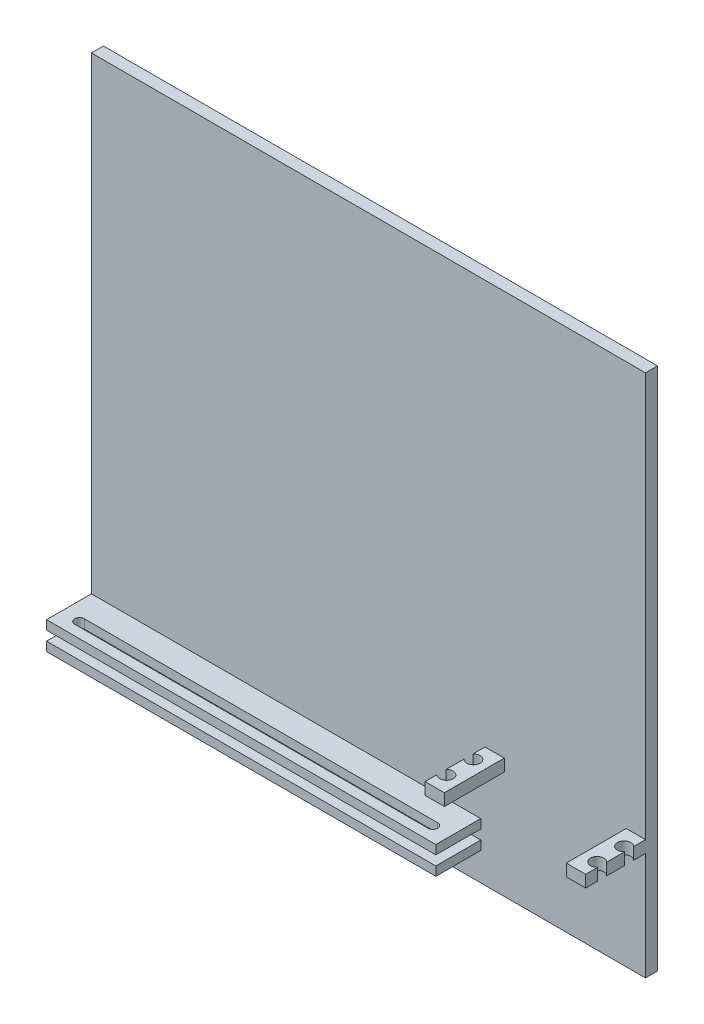
ISO-10303-21;
HEADER;
FILE_DESCRIPTION(('STEP AP214'),'2;1');
FILE_NAME('part.step','',(''),(''),'','','');
FILE_SCHEMA(('AUTOMOTIVE_DESIGN { 1 0 10303 214 1 1 1 1 }'));
ENDSEC;
DATA;
#1=APPLICATION_CONTEXT('core data for automotive mechanical design processes');
#2=APPLICATION_PROTOCOL_DEFINITION('international standard','automotive_design',2000,#1);
#3=PRODUCT_CONTEXT('',#1,'mechanical');
#4=PRODUCT('Part','Part','',(#3));
#5=PRODUCT_RELATED_PRODUCT_CATEGORY('part','',(#4));
#6=PRODUCT_DEFINITION_FORMATION('','',#4);
#7=PRODUCT_DEFINITION_CONTEXT('part definition',#1,'design');
#8=PRODUCT_DEFINITION('design','',#6,#7);
#9=PRODUCT_DEFINITION_SHAPE('','',#8);
#10=(LENGTH_UNIT() NAMED_UNIT(*) SI_UNIT(.MILLI.,.METRE.));
#11=(NAMED_UNIT(*) PLANE_ANGLE_UNIT() SI_UNIT($,.RADIAN.));
#12=(NAMED_UNIT(*) SI_UNIT($,.STERADIAN.) SOLID_ANGLE_UNIT());
#13=UNCERTAINTY_MEASURE_WITH_UNIT(LENGTH_MEASURE(1.E-05),#10,'distance_accuracy_value','');
#14=(GEOMETRIC_REPRESENTATION_CONTEXT(3) GLOBAL_UNCERTAINTY_ASSIGNED_CONTEXT((#13)) GLOBAL_UNIT_ASSIGNED_CONTEXT((#10,
#11,#12)) REPRESENTATION_CONTEXT('',''));
#15=CARTESIAN_POINT('',(0.,0.,0.));
#16=DIRECTION('',(0.,0.,1.));
#17=DIRECTION('',(1.,0.,0.));
#18=AXIS2_PLACEMENT_3D('',#15,#16,#17);
#19=CARTESIAN_POINT('',(0.,0.,4.));
#20=DIRECTION('',(0.,0.,1.));
#21=DIRECTION('',(1.,0.,0.));
#22=AXIS2_PLACEMENT_3D('',#19,#20,#21);
#23=PLANE('',#22);
#24=DIRECTION('',(-1.,0.,0.));
#25=VECTOR('',#24,1.);
#26=CARTESIAN_POINT('',(35.7040139049978,-6.38683431952661,4.));
#27=LINE('',#26,#25);
#28=CARTESIAN_POINT('',(35.7040139049978,-6.38683431952661,4.));
#29=VERTEX_POINT('',#28);
#30=CARTESIAN_POINT('',(29.2540139049978,-6.38683431952661,4.));
#31=VERTEX_POINT('',#30);
#32=EDGE_CURVE('E432',#29,#31,#27,.T.);
#33=ORIENTED_EDGE('',*,*,#32,.F.);
#34=DIRECTION('',(0.,1.,0.));
#35=VECTOR('',#34,1.);
#36=CARTESIAN_POINT('',(35.7040139049978,-10.3868343195266,4.));
#37=LINE('',#36,#35);
#38=CARTESIAN_POINT('',(35.7040139049978,-10.3868343195266,4.));
#39=VERTEX_POINT('',#38);
#40=EDGE_CURVE('E418',#39,#29,#37,.T.);
#41=ORIENTED_EDGE('',*,*,#40,.F.);
#42=DIRECTION('',(1.,0.,0.));
#43=VECTOR('',#42,1.);
#44=CARTESIAN_POINT('',(35.7040139049978,-10.3868343195266,4.));
#45=LINE('',#44,#43);
#46=CARTESIAN_POINT('',(29.2540139049978,-10.3868343195266,4.));
#47=VERTEX_POINT('',#46);
#48=EDGE_CURVE('E423',#47,#39,#45,.T.);
#49=ORIENTED_EDGE('',*,*,#48,.F.);
#50=DIRECTION('',(0.,-1.,0.));
#51=VECTOR('',#50,1.);
#52=CARTESIAN_POINT('',(29.2540139049978,-10.3868343195266,4.));
#53=LINE('',#52,#51);
#54=EDGE_CURVE('E435',#31,#47,#53,.T.);
#55=ORIENTED_EDGE('',*,*,#54,.F.);
#56=EDGE_LOOP('',(#33,#41,#49,#55));
#57=FACE_BOUND('',#56,.T.);
#58=DIRECTION('',(0.,1.,0.));
#59=VECTOR('',#58,1.);
#60=CARTESIAN_POINT('',(27.8540139049979,-33.9868343195266,4.));
#61=LINE('',#60,#59);
#62=CARTESIAN_POINT('',(27.8540139049979,-36.9868343195266,4.));
#63=VERTEX_POINT('',#62);
#64=CARTESIAN_POINT('',(27.8540139049979,-33.9868343195266,4.));
#65=VERTEX_POINT('',#64);
#66=EDGE_CURVE('E340',#63,#65,#61,.T.);
#67=ORIENTED_EDGE('',*,*,#66,.F.);
#68=DIRECTION('',(1.,0.,0.));
#69=VECTOR('',#68,1.);
#70=CARTESIAN_POINT('',(-102.145986095002,-36.9868343195266,4.));
#71=LINE('',#70,#69);
#72=CARTESIAN_POINT('',(-102.145986095002,-36.9868343195266,4.));
#73=VERTEX_POINT('',#72);
#74=EDGE_CURVE('E326',#73,#63,#71,.T.);
#75=ORIENTED_EDGE('',*,*,#74,.F.);
#76=DIRECTION('',(0.,-1.,0.));
#77=VECTOR('',#76,1.);
#78=CARTESIAN_POINT('',(-102.145986095002,128.613165680473,4.));
#79=LINE('',#78,#77);
#80=CARTESIAN_POINT('',(-102.145986095002,-46.3868343195266,4.));
#81=VERTEX_POINT('',#80);
#82=EDGE_CURVE('E492',#73,#81,#79,.T.);
#83=ORIENTED_EDGE('',*,*,#82,.T.);
#84=DIRECTION('',(1.,0.,0.));
#85=VECTOR('',#84,1.);
#86=CARTESIAN_POINT('',(-102.145986095002,-46.3868343195266,4.));
#87=LINE('',#86,#85);
#88=CARTESIAN_POINT('',(82.8540139049978,-46.3868343195266,4.));
#89=VERTEX_POINT('',#88);
#90=EDGE_CURVE('E490',#81,#89,#87,.T.);
#91=ORIENTED_EDGE('',*,*,#90,.T.);
#92=DIRECTION('',(0.,1.,0.));
#93=VECTOR('',#92,1.);
#94=CARTESIAN_POINT('',(82.8540139049978,128.613165680473,4.));
#95=LINE('',#94,#93);
#96=CARTESIAN_POINT('',(82.8540139049978,-10.3868343195266,4.));
#97=VERTEX_POINT('',#96);
#98=EDGE_CURVE('E495',#89,#97,#95,.T.);
#99=ORIENTED_EDGE('',*,*,#98,.T.);
#100=DIRECTION('',(1.,0.,0.));
#101=VECTOR('',#100,1.);
#102=CARTESIAN_POINT('',(76.4040139049978,-10.3868343195266,4.));
#103=LINE('',#102,#101);
#104=CARTESIAN_POINT('',(76.4040139049978,-10.3868343195266,4.));
#105=VERTEX_POINT('',#104);
#106=EDGE_CURVE('E467',#105,#97,#103,.T.);
#107=ORIENTED_EDGE('',*,*,#106,.F.);
#108=DIRECTION('',(0.,-1.,0.));
#109=VECTOR('',#108,1.);
#110=CARTESIAN_POINT('',(76.4040139049978,-10.3868343195266,4.));
#111=LINE('',#110,#109);
#112=CARTESIAN_POINT('',(76.4040139049978,-6.38683431952661,4.));
#113=VERTEX_POINT('',#112);
#114=EDGE_CURVE('E453',#113,#105,#111,.T.);
#115=ORIENTED_EDGE('',*,*,#114,.F.);
#116=DIRECTION('',(-1.,0.,0.));
#117=VECTOR('',#116,1.);
#118=CARTESIAN_POINT('',(76.4040139049978,-6.38683431952661,4.));
#119=LINE('',#118,#117);
#120=CARTESIAN_POINT('',(82.8540139049978,-6.38683431952661,4.));
#121=VERTEX_POINT('',#120);
#122=EDGE_CURVE('E458',#121,#113,#119,.T.);
#123=ORIENTED_EDGE('',*,*,#122,.F.);
#124=CARTESIAN_POINT('',(82.8540139049978,128.613165680473,4.));
#125=VERTEX_POINT('',#124);
#126=EDGE_CURVE('E494',#121,#125,#95,.T.);
#127=ORIENTED_EDGE('',*,*,#126,.T.);
#128=DIRECTION('',(-1.,0.,0.));
#129=VECTOR('',#128,1.);
#130=CARTESIAN_POINT('',(-102.145986095002,128.613165680473,4.));
#131=LINE('',#130,#129);
#132=CARTESIAN_POINT('',(-102.145986095002,128.613165680473,4.));
#133=VERTEX_POINT('',#132);
#134=EDGE_CURVE('E498',#125,#133,#131,.T.);
#135=ORIENTED_EDGE('',*,*,#134,.T.);
#136=CARTESIAN_POINT('',(-102.145986095002,-27.7868343195266,4.));
#137=VERTEX_POINT('',#136);
#138=EDGE_CURVE('E488',#133,#137,#79,.T.);
#139=ORIENTED_EDGE('',*,*,#138,.T.);
#140=DIRECTION('',(-1.,0.,0.));
#141=VECTOR('',#140,1.);
#142=CARTESIAN_POINT('',(-102.145986095002,-27.7868343195266,4.));
#143=LINE('',#142,#141);
#144=CARTESIAN_POINT('',(27.8540139049979,-27.7868343195266,4.));
#145=VERTEX_POINT('',#144);
#146=EDGE_CURVE('E361',#145,#137,#143,.T.);
#147=ORIENTED_EDGE('',*,*,#146,.F.);
#148=DIRECTION('',(0.,1.,0.));
#149=VECTOR('',#148,1.);
#150=CARTESIAN_POINT('',(27.8540139049979,-30.7868343195266,4.));
#151=LINE('',#150,#149);
#152=CARTESIAN_POINT('',(27.8540139049979,-30.7868343195266,4.));
#153=VERTEX_POINT('',#152);
#154=EDGE_CURVE('E370',#153,#145,#151,.T.);
#155=ORIENTED_EDGE('',*,*,#154,.F.);
#156=DIRECTION('',(1.,0.,0.));
#157=VECTOR('',#156,1.);
#158=CARTESIAN_POINT('',(-102.145986095002,-30.7868343195266,4.));
#159=LINE('',#158,#157);
#160=CARTESIAN_POINT('',(-102.145986095002,-30.7868343195266,4.));
#161=VERTEX_POINT('',#160);
#162=EDGE_CURVE('E356',#161,#153,#159,.T.);
#163=ORIENTED_EDGE('',*,*,#162,.F.);
#164=CARTESIAN_POINT('',(-102.145986095002,-33.9868343195266,4.));
#165=VERTEX_POINT('',#164);
#166=EDGE_CURVE('E491',#161,#165,#79,.T.);
#167=ORIENTED_EDGE('',*,*,#166,.T.);
#168=DIRECTION('',(-1.,0.,0.));
#169=VECTOR('',#168,1.);
#170=CARTESIAN_POINT('',(-102.145986095002,-33.9868343195266,4.));
#171=LINE('',#170,#169);
#172=EDGE_CURVE('E331',#65,#165,#171,.T.);
#173=ORIENTED_EDGE('',*,*,#172,.F.);
#174=EDGE_LOOP('',(#67,#75,#83,#91,#99,#107,#115,#123,#127,#135,#139,#147,#155,#163,#167,#173));
#175=FACE_BOUND('',#174,.T.);
#176=ADVANCED_FACE('F39',(#57,#175),#23,.T.);
#177=CARTESIAN_POINT('',(82.8540139049978,128.613165680473,4.));
#178=DIRECTION('',(-1.,0.,0.));
#179=DIRECTION('',(0.,0.,1.));
#180=AXIS2_PLACEMENT_3D('',#177,#178,#179);
#181=PLANE('',#180);
#182=DIRECTION('',(0.,0.,-1.));
#183=VECTOR('',#182,1.);
#184=CARTESIAN_POINT('',(82.8540139049978,-6.38683431952661,23.9999999999999));
#185=LINE('',#184,#183);
#186=CARTESIAN_POINT('',(82.8540139049978,-6.38683431952661,8.01477274466153));
#187=VERTEX_POINT('',#186);
#188=EDGE_CURVE('E474',#187,#121,#185,.T.);
#189=ORIENTED_EDGE('',*,*,#188,.F.);
#190=DIRECTION('',(0.,-1.,0.));
#191=VECTOR('',#190,1.);
#192=CARTESIAN_POINT('',(82.8540139049978,128.614165680473,8.01477274466153));
#193=LINE('',#192,#191);
#194=CARTESIAN_POINT('',(82.8540139049978,-10.3868343195266,8.01477274466154));
#195=VERTEX_POINT('',#194);
#196=EDGE_CURVE('E389',#195,#187,#193,.F.);
#197=ORIENTED_EDGE('',*,*,#196,.F.);
#198=DIRECTION('',(0.,0.,-1.));
#199=VECTOR('',#198,1.);
#200=CARTESIAN_POINT('',(82.8540139049978,-10.3868343195266,23.9999999999999));
#201=LINE('',#200,#199);
#202=EDGE_CURVE('E478',#195,#97,#201,.T.);
#203=ORIENTED_EDGE('',*,*,#202,.T.);
#204=ORIENTED_EDGE('',*,*,#98,.F.);
#205=DIRECTION('',(0.,0.,-1.));
#206=VECTOR('',#205,1.);
#207=CARTESIAN_POINT('',(82.8540139049978,-46.3868343195266,4.));
#208=LINE('',#207,#206);
#209=CARTESIAN_POINT('',(82.8540139049978,-46.3868343195266,0.));
#210=VERTEX_POINT('',#209);
#211=EDGE_CURVE('E514',#89,#210,#208,.T.);
#212=ORIENTED_EDGE('',*,*,#211,.T.);
#213=DIRECTION('',(0.,1.,0.));
#214=VECTOR('',#213,1.);
#215=CARTESIAN_POINT('',(82.8540139049978,128.613165680473,0.));
#216=LINE('',#215,#214);
#217=CARTESIAN_POINT('',(82.8540139049978,128.613165680473,0.));
#218=VERTEX_POINT('',#217);
#219=EDGE_CURVE('E505',#210,#218,#216,.T.);
#220=ORIENTED_EDGE('',*,*,#219,.T.);
#221=DIRECTION('',(0.,0.,-1.));
#222=VECTOR('',#221,1.);
#223=CARTESIAN_POINT('',(82.8540139049978,128.613165680473,4.));
#224=LINE('',#223,#222);
#225=EDGE_CURVE('E511',#125,#218,#224,.T.);
#226=ORIENTED_EDGE('',*,*,#225,.F.);
#227=ORIENTED_EDGE('',*,*,#126,.F.);
#228=EDGE_LOOP('',(#189,#197,#203,#204,#212,#220,#226,#227));
#229=FACE_BOUND('',#228,.T.);
#230=ADVANCED_FACE('F564',(#229),#181,.F.);
#231=CARTESIAN_POINT('',(82.8540139049978,-10.3868343195266,17.0147727446615));
#232=VERTEX_POINT('',#231);
#233=CARTESIAN_POINT('',(82.8540139049978,-10.3868343195266,10.9852272553383));
#234=VERTEX_POINT('',#233);
#235=EDGE_CURVE('E484',#232,#234,#201,.T.);
#236=ORIENTED_EDGE('',*,*,#235,.T.);
#237=DIRECTION('',(0.,-1.,0.));
#238=VECTOR('',#237,1.);
#239=CARTESIAN_POINT('',(82.8540139049978,128.614165680473,10.9852272553383));
#240=LINE('',#239,#238);
#241=CARTESIAN_POINT('',(82.8540139049978,-6.38683431952661,10.9852272553383));
#242=VERTEX_POINT('',#241);
#243=EDGE_CURVE('E387',#242,#234,#240,.T.);
#244=ORIENTED_EDGE('',*,*,#243,.F.);
#245=CARTESIAN_POINT('',(82.8540139049978,-6.38683431952661,17.0147727446615));
#246=VERTEX_POINT('',#245);
#247=EDGE_CURVE('E479',#246,#242,#185,.T.);
#248=ORIENTED_EDGE('',*,*,#247,.F.);
#249=DIRECTION('',(0.,-1.,0.));
#250=VECTOR('',#249,1.);
#251=CARTESIAN_POINT('',(82.8540139049978,128.614165680473,17.0147727446615));
#252=LINE('',#251,#250);
#253=EDGE_CURVE('E412',#232,#246,#252,.F.);
#254=ORIENTED_EDGE('',*,*,#253,.F.);
#255=EDGE_LOOP('',(#236,#244,#248,#254));
#256=FACE_BOUND('',#255,.T.);
#257=ADVANCED_FACE('F572',(#256),#181,.F.);
#258=CARTESIAN_POINT('',(29.2540139049978,-10.3868343195266,23.9999999999999));
#259=DIRECTION('',(1.,0.,0.));
#260=DIRECTION('',(0.,0.,-1.));
#261=AXIS2_PLACEMENT_3D('',#258,#259,#260);
#262=PLANE('',#261);
#263=DIRECTION('',(0.,0.,-1.));
#264=VECTOR('',#263,1.);
#265=CARTESIAN_POINT('',(29.2540139049978,-6.38683431952661,23.9999999999999));
#266=LINE('',#265,#264);
#267=CARTESIAN_POINT('',(29.2540139049978,-6.38683431952661,23.9999999999999));
#268=VERTEX_POINT('',#267);
#269=CARTESIAN_POINT('',(29.2540139049978,-6.38683431952661,19.9852272553383));
#270=VERTEX_POINT('',#269);
#271=EDGE_CURVE('E447',#268,#270,#266,.T.);
#272=ORIENTED_EDGE('',*,*,#271,.T.);
#273=DIRECTION('',(0.,-1.,0.));
#274=VECTOR('',#273,1.);
#275=CARTESIAN_POINT('',(29.2540139049978,128.614165680473,19.9852272553383));
#276=LINE('',#275,#274);
#277=CARTESIAN_POINT('',(29.2540139049978,-10.3868343195266,19.9852272553383));
#278=VERTEX_POINT('',#277);
#279=EDGE_CURVE('E406',#278,#270,#276,.F.);
#280=ORIENTED_EDGE('',*,*,#279,.F.);
#281=DIRECTION('',(0.,0.,-1.));
#282=VECTOR('',#281,1.);
#283=CARTESIAN_POINT('',(29.2540139049978,-10.3868343195266,23.9999999999999));
#284=LINE('',#283,#282);
#285=CARTESIAN_POINT('',(29.2540139049978,-10.3868343195266,23.9999999999999));
#286=VERTEX_POINT('',#285);
#287=EDGE_CURVE('E442',#286,#278,#284,.T.);
#288=ORIENTED_EDGE('',*,*,#287,.F.);
#289=DIRECTION('',(0.,-1.,0.));
#290=VECTOR('',#289,1.);
#291=CARTESIAN_POINT('',(29.2540139049978,-10.3868343195266,23.9999999999999));
#292=LINE('',#291,#290);
#293=EDGE_CURVE('E425',#268,#286,#292,.T.);
#294=ORIENTED_EDGE('',*,*,#293,.F.);
#295=EDGE_LOOP('',(#272,#280,#288,#294));
#296=FACE_BOUND('',#295,.T.);
#297=ADVANCED_FACE('F682',(#296),#262,.F.);
#298=CARTESIAN_POINT('',(29.2540139049978,-10.3868343195266,17.0147727446615));
#299=VERTEX_POINT('',#298);
#300=CARTESIAN_POINT('',(29.2540139049978,-10.3868343195266,10.9852272553383));
#301=VERTEX_POINT('',#300);
#302=EDGE_CURVE('E446',#299,#301,#284,.T.);
#303=ORIENTED_EDGE('',*,*,#302,.F.);
#304=DIRECTION('',(0.,-1.,0.));
#305=VECTOR('',#304,1.);
#306=CARTESIAN_POINT('',(29.2540139049978,128.614165680473,17.0147727446615));
#307=LINE('',#306,#305);
#308=CARTESIAN_POINT('',(29.2540139049978,-6.38683431952661,17.0147727446615));
#309=VERTEX_POINT('',#308);
#310=EDGE_CURVE('E386',#309,#299,#307,.T.);
#311=ORIENTED_EDGE('',*,*,#310,.F.);
#312=CARTESIAN_POINT('',(29.2540139049978,-6.38683431952661,10.9852272553383));
#313=VERTEX_POINT('',#312);
#314=EDGE_CURVE('E451',#309,#313,#266,.T.);
#315=ORIENTED_EDGE('',*,*,#314,.T.);
#316=DIRECTION('',(0.,-1.,0.));
#317=VECTOR('',#316,1.);
#318=CARTESIAN_POINT('',(29.2540139049978,128.614165680473,10.9852272553383));
#319=LINE('',#318,#317);
#320=EDGE_CURVE('E399',#301,#313,#319,.F.);
#321=ORIENTED_EDGE('',*,*,#320,.F.);
#322=EDGE_LOOP('',(#303,#311,#315,#321));
#323=FACE_BOUND('',#322,.T.);
#324=ADVANCED_FACE('F597',(#323),#262,.F.);
#325=CARTESIAN_POINT('',(-102.145986095002,128.613165680473,4.));
#326=DIRECTION('',(1.,0.,0.));
#327=DIRECTION('',(0.,1.,0.));
#328=AXIS2_PLACEMENT_3D('',#325,#326,#327);
#329=PLANE('',#328);
#330=DIRECTION('',(0.,-1.,0.));
#331=VECTOR('',#330,1.);
#332=CARTESIAN_POINT('',(-102.145986095002,128.613165680473,0.));
#333=LINE('',#332,#331);
#334=CARTESIAN_POINT('',(-102.145986095002,128.613165680473,0.));
#335=VERTEX_POINT('',#334);
#336=CARTESIAN_POINT('',(-102.145986095002,-46.3868343195266,0.));
#337=VERTEX_POINT('',#336);
#338=EDGE_CURVE('E487',#335,#337,#333,.T.);
#339=ORIENTED_EDGE('',*,*,#338,.T.);
#340=DIRECTION('',(0.,0.,-1.));
#341=VECTOR('',#340,1.);
#342=CARTESIAN_POINT('',(-102.145986095002,-46.3868343195266,4.));
#343=LINE('',#342,#341);
#344=EDGE_CURVE('E517',#81,#337,#343,.T.);
#345=ORIENTED_EDGE('',*,*,#344,.F.);
#346=ORIENTED_EDGE('',*,*,#82,.F.);
#347=DIRECTION('',(0.,0.,-1.));
#348=VECTOR('',#347,1.);
#349=CARTESIAN_POINT('',(-102.145986095002,-36.9868343195266,19.));
#350=LINE('',#349,#348);
#351=CARTESIAN_POINT('',(-102.145986095002,-36.9868343195266,19.));
#352=VERTEX_POINT('',#351);
#353=EDGE_CURVE('E353',#352,#73,#350,.T.);
#354=ORIENTED_EDGE('',*,*,#353,.F.);
#355=DIRECTION('',(0.,-1.,0.));
#356=VECTOR('',#355,1.);
#357=CARTESIAN_POINT('',(-102.145986095002,-33.9868343195266,19.));
#358=LINE('',#357,#356);
#359=CARTESIAN_POINT('',(-102.145986095002,-33.9868343195266,19.));
#360=VERTEX_POINT('',#359);
#361=EDGE_CURVE('E327',#360,#352,#358,.T.);
#362=ORIENTED_EDGE('',*,*,#361,.F.);
#363=DIRECTION('',(0.,0.,-1.));
#364=VECTOR('',#363,1.);
#365=CARTESIAN_POINT('',(-102.145986095002,-33.9868343195266,19.));
#366=LINE('',#365,#364);
#367=EDGE_CURVE('E337',#360,#165,#366,.T.);
#368=ORIENTED_EDGE('',*,*,#367,.T.);
#369=ORIENTED_EDGE('',*,*,#166,.F.);
#370=DIRECTION('',(0.,0.,-1.));
#371=VECTOR('',#370,1.);
#372=CARTESIAN_POINT('',(-102.145986095002,-30.7868343195266,19.));
#373=LINE('',#372,#371);
#374=CARTESIAN_POINT('',(-102.145986095002,-30.7868343195266,19.));
#375=VERTEX_POINT('',#374);
#376=EDGE_CURVE('E383',#375,#161,#373,.T.);
#377=ORIENTED_EDGE('',*,*,#376,.F.);
#378=DIRECTION('',(0.,-1.,0.));
#379=VECTOR('',#378,1.);
#380=CARTESIAN_POINT('',(-102.145986095002,-30.7868343195266,19.));
#381=LINE('',#380,#379);
#382=CARTESIAN_POINT('',(-102.145986095002,-27.7868343195266,19.));
#383=VERTEX_POINT('',#382);
#384=EDGE_CURVE('E357',#383,#375,#381,.T.);
#385=ORIENTED_EDGE('',*,*,#384,.F.);
#386=DIRECTION('',(0.,0.,-1.));
#387=VECTOR('',#386,1.);
#388=CARTESIAN_POINT('',(-102.145986095002,-27.7868343195266,19.));
#389=LINE('',#388,#387);
#390=EDGE_CURVE('E367',#383,#137,#389,.T.);
#391=ORIENTED_EDGE('',*,*,#390,.T.);
#392=ORIENTED_EDGE('',*,*,#138,.F.);
#393=DIRECTION('',(0.,0.,-1.));
#394=VECTOR('',#393,1.);
#395=CARTESIAN_POINT('',(-102.145986095002,128.613165680473,4.));
#396=LINE('',#395,#394);
#397=EDGE_CURVE('E500',#133,#335,#396,.T.);
#398=ORIENTED_EDGE('',*,*,#397,.T.);
#399=EDGE_LOOP('',(#339,#345,#346,#354,#362,#368,#369,#377,#385,#391,#392,#398));
#400=FACE_BOUND('',#399,.T.);
#401=ADVANCED_FACE('F41',(#400),#329,.F.);
#402=CARTESIAN_POINT('',(-102.145986095002,-46.3868343195266,4.));
#403=DIRECTION('',(0.,1.,0.));
#404=DIRECTION('',(0.,0.,1.));
#405=AXIS2_PLACEMENT_3D('',#402,#403,#404);
#406=PLANE('',#405);
#407=DIRECTION('',(1.,0.,0.));
#408=VECTOR('',#407,1.);
#409=CARTESIAN_POINT('',(-102.145986095002,-46.3868343195266,0.));
#410=LINE('',#409,#408);
#411=EDGE_CURVE('E503',#337,#210,#410,.T.);
#412=ORIENTED_EDGE('',*,*,#411,.T.);
#413=ORIENTED_EDGE('',*,*,#211,.F.);
#414=ORIENTED_EDGE('',*,*,#90,.F.);
#415=ORIENTED_EDGE('',*,*,#344,.T.);
#416=EDGE_LOOP('',(#412,#413,#414,#415));
#417=FACE_BOUND('',#416,.T.);
#418=ADVANCED_FACE('F590',(#417),#406,.F.);
#419=CARTESIAN_POINT('',(82.8540139049978,-10.3868343195266,23.9999999999999));
#420=VERTEX_POINT('',#419);
#421=CARTESIAN_POINT('',(82.8540139049978,-10.3868343195266,19.9852272553383));
#422=VERTEX_POINT('',#421);
#423=EDGE_CURVE('E480',#420,#422,#201,.T.);
#424=ORIENTED_EDGE('',*,*,#423,.T.);
#425=DIRECTION('',(0.,-1.,0.));
#426=VECTOR('',#425,1.);
#427=CARTESIAN_POINT('',(82.8540139049978,128.614165680473,19.9852272553383));
#428=LINE('',#427,#426);
#429=CARTESIAN_POINT('',(82.8540139049978,-6.38683431952661,19.9852272553383));
#430=VERTEX_POINT('',#429);
#431=EDGE_CURVE('E396',#430,#422,#428,.T.);
#432=ORIENTED_EDGE('',*,*,#431,.F.);
#433=CARTESIAN_POINT('',(82.8540139049978,-6.38683431952661,23.9999999999999));
#434=VERTEX_POINT('',#433);
#435=EDGE_CURVE('E475',#434,#430,#185,.T.);
#436=ORIENTED_EDGE('',*,*,#435,.F.);
#437=DIRECTION('',(0.,1.,0.));
#438=VECTOR('',#437,1.);
#439=CARTESIAN_POINT('',(82.8540139049978,-10.3868343195266,23.9999999999999));
#440=LINE('',#439,#438);
#441=EDGE_CURVE('E460',#420,#434,#440,.T.);
#442=ORIENTED_EDGE('',*,*,#441,.F.);
#443=EDGE_LOOP('',(#424,#432,#436,#442));
#444=FACE_BOUND('',#443,.T.);
#445=ADVANCED_FACE('F575',(#444),#181,.F.);
#446=CARTESIAN_POINT('',(-102.145986095002,128.613165680473,4.));
#447=DIRECTION('',(0.,-1.,0.));
#448=DIRECTION('',(0.,0.,-1.));
#449=AXIS2_PLACEMENT_3D('',#446,#447,#448);
#450=PLANE('',#449);
#451=DIRECTION('',(-1.,0.,0.));
#452=VECTOR('',#451,1.);
#453=CARTESIAN_POINT('',(-102.145986095002,128.613165680473,0.));
#454=LINE('',#453,#452);
#455=EDGE_CURVE('E507',#218,#335,#454,.T.);
#456=ORIENTED_EDGE('',*,*,#455,.T.);
#457=ORIENTED_EDGE('',*,*,#397,.F.);
#458=ORIENTED_EDGE('',*,*,#134,.F.);
#459=ORIENTED_EDGE('',*,*,#225,.T.);
#460=EDGE_LOOP('',(#456,#457,#458,#459));
#461=FACE_BOUND('',#460,.T.);
#462=ADVANCED_FACE('F585',(#461),#450,.F.);
#463=CARTESIAN_POINT('',(0.,0.,0.));
#464=DIRECTION('',(0.,0.,1.));
#465=DIRECTION('',(1.,0.,0.));
#466=AXIS2_PLACEMENT_3D('',#463,#464,#465);
#467=PLANE('',#466);
#468=ORIENTED_EDGE('',*,*,#338,.F.);
#469=ORIENTED_EDGE('',*,*,#455,.F.);
#470=ORIENTED_EDGE('',*,*,#219,.F.);
#471=ORIENTED_EDGE('',*,*,#411,.F.);
#472=EDGE_LOOP('',(#468,#469,#470,#471));
#473=FACE_BOUND('',#472,.T.);
#474=ADVANCED_FACE('F582',(#473),#467,.F.);
#475=CARTESIAN_POINT('',(76.4040139049978,-10.3868343195266,23.9999999999999));
#476=DIRECTION('',(1.,0.,0.));
#477=DIRECTION('',(0.,0.,-1.));
#478=AXIS2_PLACEMENT_3D('',#475,#476,#477);
#479=PLANE('',#478);
#480=ORIENTED_EDGE('',*,*,#114,.T.);
#481=DIRECTION('',(0.,0.,-1.));
#482=VECTOR('',#481,1.);
#483=CARTESIAN_POINT('',(76.4040139049978,-10.3868343195266,23.9999999999999));
#484=LINE('',#483,#482);
#485=CARTESIAN_POINT('',(76.4040139049978,-10.3868343195266,23.9999999999999));
#486=VERTEX_POINT('',#485);
#487=EDGE_CURVE('E483',#486,#105,#484,.T.);
#488=ORIENTED_EDGE('',*,*,#487,.F.);
#489=DIRECTION('',(0.,-1.,0.));
#490=VECTOR('',#489,1.);
#491=CARTESIAN_POINT('',(76.4040139049978,-10.3868343195266,23.9999999999999));
#492=LINE('',#491,#490);
#493=CARTESIAN_POINT('',(76.4040139049978,-6.38683431952661,23.9999999999999));
#494=VERTEX_POINT('',#493);
#495=EDGE_CURVE('E454',#494,#486,#492,.T.);
#496=ORIENTED_EDGE('',*,*,#495,.F.);
#497=DIRECTION('',(0.,0.,-1.));
#498=VECTOR('',#497,1.);
#499=CARTESIAN_POINT('',(76.4040139049978,-6.38683431952661,23.9999999999999));
#500=LINE('',#499,#498);
#501=EDGE_CURVE('E464',#494,#113,#500,.T.);
#502=ORIENTED_EDGE('',*,*,#501,.T.);
#503=EDGE_LOOP('',(#480,#488,#496,#502));
#504=FACE_BOUND('',#503,.T.);
#505=ADVANCED_FACE('F580',(#504),#479,.F.);
#506=CARTESIAN_POINT('',(76.4040139049978,-10.3868343195266,23.9999999999999));
#507=DIRECTION('',(0.,1.,0.));
#508=DIRECTION('',(0.,0.,1.));
#509=AXIS2_PLACEMENT_3D('',#506,#507,#508);
#510=PLANE('',#509);
#511=ORIENTED_EDGE('',*,*,#202,.F.);
#512=CARTESIAN_POINT('',(81.2040139049978,-10.3868343195266,9.4999999999999));
#513=DIRECTION('',(0.,-1.,0.));
#514=DIRECTION('',(0.,0.,-1.));
#515=AXIS2_PLACEMENT_3D('',#512,#513,#514);
#516=CIRCLE('',#515,2.22000000000001);
#517=EDGE_CURVE('E392',#234,#195,#516,.T.);
#518=ORIENTED_EDGE('',*,*,#517,.F.);
#519=ORIENTED_EDGE('',*,*,#235,.F.);
#520=CARTESIAN_POINT('',(81.2040139049978,-10.3868343195266,18.4999999999999));
#521=DIRECTION('',(0.,-1.,0.));
#522=DIRECTION('',(0.,0.,-1.));
#523=AXIS2_PLACEMENT_3D('',#520,#521,#522);
#524=CIRCLE('',#523,2.22000000000001);
#525=EDGE_CURVE('E414',#422,#232,#524,.T.);
#526=ORIENTED_EDGE('',*,*,#525,.F.);
#527=ORIENTED_EDGE('',*,*,#423,.F.);
#528=DIRECTION('',(1.,0.,0.));
#529=VECTOR('',#528,1.);
#530=CARTESIAN_POINT('',(76.4040139049978,-10.3868343195266,23.9999999999999));
#531=LINE('',#530,#529);
#532=EDGE_CURVE('E457',#486,#420,#531,.T.);
#533=ORIENTED_EDGE('',*,*,#532,.F.);
#534=ORIENTED_EDGE('',*,*,#487,.T.);
#535=ORIENTED_EDGE('',*,*,#106,.T.);
#536=EDGE_LOOP('',(#511,#518,#519,#526,#527,#533,#534,#535));
#537=FACE_BOUND('',#536,.T.);
#538=ADVANCED_FACE('F696',(#537),#510,.F.);
#539=CARTESIAN_POINT('',(76.4040139049978,-6.38683431952661,23.9999999999999));
#540=DIRECTION('',(0.,-1.,0.));
#541=DIRECTION('',(0.,0.,-1.));
#542=AXIS2_PLACEMENT_3D('',#539,#540,#541);
#543=PLANE('',#542);
#544=ORIENTED_EDGE('',*,*,#247,.T.);
#545=CARTESIAN_POINT('',(81.2040139049978,-6.38683431952661,9.4999999999999));
#546=DIRECTION('',(0.,-1.,0.));
#547=DIRECTION('',(0.,0.,-1.));
#548=AXIS2_PLACEMENT_3D('',#545,#546,#547);
#549=CIRCLE('',#548,2.22000000000001);
#550=EDGE_CURVE('E394',#187,#242,#549,.F.);
#551=ORIENTED_EDGE('',*,*,#550,.F.);
#552=ORIENTED_EDGE('',*,*,#188,.T.);
#553=ORIENTED_EDGE('',*,*,#122,.T.);
#554=ORIENTED_EDGE('',*,*,#501,.F.);
#555=DIRECTION('',(-1.,0.,0.));
#556=VECTOR('',#555,1.);
#557=CARTESIAN_POINT('',(76.4040139049978,-6.38683431952661,23.9999999999999));
#558=LINE('',#557,#556);
#559=EDGE_CURVE('E462',#434,#494,#558,.T.);
#560=ORIENTED_EDGE('',*,*,#559,.F.);
#561=ORIENTED_EDGE('',*,*,#435,.T.);
#562=CARTESIAN_POINT('',(81.2040139049978,-6.38683431952661,18.4999999999999));
#563=DIRECTION('',(0.,-1.,0.));
#564=DIRECTION('',(0.,0.,-1.));
#565=AXIS2_PLACEMENT_3D('',#562,#563,#564);
#566=CIRCLE('',#565,2.22000000000001);
#567=EDGE_CURVE('E416',#246,#430,#566,.F.);
#568=ORIENTED_EDGE('',*,*,#567,.F.);
#569=EDGE_LOOP('',(#544,#551,#552,#553,#554,#560,#561,#568));
#570=FACE_BOUND('',#569,.T.);
#571=ADVANCED_FACE('F693',(#570),#543,.F.);
#572=CARTESIAN_POINT('',(0.,0.,23.9999999999999));
#573=DIRECTION('',(0.,0.,-1.));
#574=DIRECTION('',(-1.,0.,0.));
#575=AXIS2_PLACEMENT_3D('',#572,#573,#574);
#576=PLANE('',#575);
#577=ORIENTED_EDGE('',*,*,#495,.T.);
#578=ORIENTED_EDGE('',*,*,#532,.T.);
#579=ORIENTED_EDGE('',*,*,#441,.T.);
#580=ORIENTED_EDGE('',*,*,#559,.T.);
#581=EDGE_LOOP('',(#577,#578,#579,#580));
#582=FACE_BOUND('',#581,.T.);
#583=ADVANCED_FACE('F689',(#582),#576,.F.);
#584=CARTESIAN_POINT('',(35.7040139049978,-10.3868343195266,23.9999999999999));
#585=DIRECTION('',(-1.,0.,0.));
#586=DIRECTION('',(0.,0.,1.));
#587=AXIS2_PLACEMENT_3D('',#584,#585,#586);
#588=PLANE('',#587);
#589=ORIENTED_EDGE('',*,*,#40,.T.);
#590=DIRECTION('',(0.,0.,-1.));
#591=VECTOR('',#590,1.);
#592=CARTESIAN_POINT('',(35.7040139049978,-6.38683431952661,23.9999999999999));
#593=LINE('',#592,#591);
#594=CARTESIAN_POINT('',(35.7040139049978,-6.38683431952661,23.9999999999999));
#595=VERTEX_POINT('',#594);
#596=EDGE_CURVE('E450',#595,#29,#593,.T.);
#597=ORIENTED_EDGE('',*,*,#596,.F.);
#598=DIRECTION('',(0.,1.,0.));
#599=VECTOR('',#598,1.);
#600=CARTESIAN_POINT('',(35.7040139049978,-10.3868343195266,23.9999999999999));
#601=LINE('',#600,#599);
#602=CARTESIAN_POINT('',(35.7040139049978,-10.3868343195266,23.9999999999999));
#603=VERTEX_POINT('',#602);
#604=EDGE_CURVE('E419',#603,#595,#601,.T.);
#605=ORIENTED_EDGE('',*,*,#604,.F.);
#606=DIRECTION('',(0.,0.,-1.));
#607=VECTOR('',#606,1.);
#608=CARTESIAN_POINT('',(35.7040139049978,-10.3868343195266,23.9999999999999));
#609=LINE('',#608,#607);
#610=EDGE_CURVE('E429',#603,#39,#609,.T.);
#611=ORIENTED_EDGE('',*,*,#610,.T.);
#612=EDGE_LOOP('',(#589,#597,#605,#611));
#613=FACE_BOUND('',#612,.T.);
#614=ADVANCED_FACE('F685',(#613),#588,.F.);
#615=CARTESIAN_POINT('',(35.7040139049978,-6.38683431952661,23.9999999999999));
#616=DIRECTION('',(0.,-1.,0.));
#617=DIRECTION('',(1.,0.,0.));
#618=AXIS2_PLACEMENT_3D('',#615,#616,#617);
#619=PLANE('',#618);
#620=ORIENTED_EDGE('',*,*,#314,.F.);
#621=CARTESIAN_POINT('',(30.9040139049978,-6.38683431952661,18.4999999999999));
#622=DIRECTION('',(0.,-1.,0.));
#623=DIRECTION('',(1.,0.,0.));
#624=AXIS2_PLACEMENT_3D('',#621,#622,#623);
#625=CIRCLE('',#624,2.22);
#626=EDGE_CURVE('E400',#270,#309,#625,.F.);
#627=ORIENTED_EDGE('',*,*,#626,.F.);
#628=ORIENTED_EDGE('',*,*,#271,.F.);
#629=DIRECTION('',(-1.,0.,0.));
#630=VECTOR('',#629,1.);
#631=CARTESIAN_POINT('',(35.7040139049978,-6.38683431952661,23.9999999999999));
#632=LINE('',#631,#630);
#633=EDGE_CURVE('E422',#595,#268,#632,.T.);
#634=ORIENTED_EDGE('',*,*,#633,.F.);
#635=ORIENTED_EDGE('',*,*,#596,.T.);
#636=ORIENTED_EDGE('',*,*,#32,.T.);
#637=CARTESIAN_POINT('',(29.2540139049978,-6.38683431952661,8.01477274466153));
#638=VERTEX_POINT('',#637);
#639=EDGE_CURVE('E445',#638,#31,#266,.T.);
#640=ORIENTED_EDGE('',*,*,#639,.F.);
#641=CARTESIAN_POINT('',(30.9040139049978,-6.38683431952661,9.4999999999999));
#642=DIRECTION('',(0.,-1.,0.));
#643=DIRECTION('',(1.,0.,0.));
#644=AXIS2_PLACEMENT_3D('',#641,#642,#643);
#645=CIRCLE('',#644,2.22);
#646=EDGE_CURVE('E390',#313,#638,#645,.F.);
#647=ORIENTED_EDGE('',*,*,#646,.F.);
#648=EDGE_LOOP('',(#620,#627,#628,#634,#635,#636,#640,#647));
#649=FACE_BOUND('',#648,.T.);
#650=ADVANCED_FACE('F680',(#649),#619,.F.);
#651=CARTESIAN_POINT('',(29.2540139049978,-10.3868343195266,8.01477274466153));
#652=VERTEX_POINT('',#651);
#653=EDGE_CURVE('E441',#652,#47,#284,.T.);
#654=ORIENTED_EDGE('',*,*,#653,.F.);
#655=DIRECTION('',(0.,-1.,0.));
#656=VECTOR('',#655,1.);
#657=CARTESIAN_POINT('',(29.2540139049978,128.614165680473,8.01477274466153));
#658=LINE('',#657,#656);
#659=EDGE_CURVE('E397',#638,#652,#658,.T.);
#660=ORIENTED_EDGE('',*,*,#659,.F.);
#661=ORIENTED_EDGE('',*,*,#639,.T.);
#662=ORIENTED_EDGE('',*,*,#54,.T.);
#663=EDGE_LOOP('',(#654,#660,#661,#662));
#664=FACE_BOUND('',#663,.T.);
#665=ADVANCED_FACE('F676',(#664),#262,.F.);
#666=CARTESIAN_POINT('',(35.7040139049978,-10.3868343195266,23.9999999999999));
#667=DIRECTION('',(0.,1.,0.));
#668=DIRECTION('',(0.,0.,1.));
#669=AXIS2_PLACEMENT_3D('',#666,#667,#668);
#670=PLANE('',#669);
#671=ORIENTED_EDGE('',*,*,#287,.T.);
#672=CARTESIAN_POINT('',(30.9040139049978,-10.3868343195266,18.4999999999999));
#673=DIRECTION('',(0.,-1.,0.));
#674=DIRECTION('',(0.,0.,-1.));
#675=AXIS2_PLACEMENT_3D('',#672,#673,#674);
#676=CIRCLE('',#675,2.22);
#677=EDGE_CURVE('E408',#299,#278,#676,.T.);
#678=ORIENTED_EDGE('',*,*,#677,.F.);
#679=ORIENTED_EDGE('',*,*,#302,.T.);
#680=CARTESIAN_POINT('',(30.9040139049978,-10.3868343195266,9.4999999999999));
#681=DIRECTION('',(0.,-1.,0.));
#682=DIRECTION('',(0.,0.,-1.));
#683=AXIS2_PLACEMENT_3D('',#680,#681,#682);
#684=CIRCLE('',#683,2.22);
#685=EDGE_CURVE('E402',#652,#301,#684,.T.);
#686=ORIENTED_EDGE('',*,*,#685,.F.);
#687=ORIENTED_EDGE('',*,*,#653,.T.);
#688=ORIENTED_EDGE('',*,*,#48,.T.);
#689=ORIENTED_EDGE('',*,*,#610,.F.);
#690=DIRECTION('',(1.,0.,0.));
#691=VECTOR('',#690,1.);
#692=CARTESIAN_POINT('',(35.7040139049978,-10.3868343195266,23.9999999999999));
#693=LINE('',#692,#691);
#694=EDGE_CURVE('E427',#286,#603,#693,.T.);
#695=ORIENTED_EDGE('',*,*,#694,.F.);
#696=EDGE_LOOP('',(#671,#678,#679,#686,#687,#688,#689,#695));
#697=FACE_BOUND('',#696,.T.);
#698=ADVANCED_FACE('F672',(#697),#670,.F.);
#699=CARTESIAN_POINT('',(0.,0.,23.9999999999999));
#700=DIRECTION('',(0.,0.,1.));
#701=DIRECTION('',(1.,0.,0.));
#702=AXIS2_PLACEMENT_3D('',#699,#700,#701);
#703=PLANE('',#702);
#704=ORIENTED_EDGE('',*,*,#604,.T.);
#705=ORIENTED_EDGE('',*,*,#633,.T.);
#706=ORIENTED_EDGE('',*,*,#293,.T.);
#707=ORIENTED_EDGE('',*,*,#694,.T.);
#708=EDGE_LOOP('',(#704,#705,#706,#707));
#709=FACE_BOUND('',#708,.T.);
#710=ADVANCED_FACE('F662',(#709),#703,.T.);
#711=CARTESIAN_POINT('',(30.9040139049978,128.614165680473,9.4999999999999));
#712=DIRECTION('',(0.,-1.,0.));
#713=DIRECTION('',(0.,0.,-1.));
#714=AXIS2_PLACEMENT_3D('',#711,#712,#713);
#715=CYLINDRICAL_SURFACE('',#714,2.22);
#716=ORIENTED_EDGE('',*,*,#320,.T.);
#717=ORIENTED_EDGE('',*,*,#646,.T.);
#718=ORIENTED_EDGE('',*,*,#659,.T.);
#719=ORIENTED_EDGE('',*,*,#685,.T.);
#720=EDGE_LOOP('',(#716,#717,#718,#719));
#721=FACE_BOUND('',#720,.T.);
#722=ADVANCED_FACE('F658',(#721),#715,.F.);
#723=CARTESIAN_POINT('',(30.9040139049978,128.614165680473,18.4999999999999));
#724=DIRECTION('',(0.,-1.,0.));
#725=DIRECTION('',(0.,0.,-1.));
#726=AXIS2_PLACEMENT_3D('',#723,#724,#725);
#727=CYLINDRICAL_SURFACE('',#726,2.22);
#728=ORIENTED_EDGE('',*,*,#279,.T.);
#729=ORIENTED_EDGE('',*,*,#626,.T.);
#730=ORIENTED_EDGE('',*,*,#310,.T.);
#731=ORIENTED_EDGE('',*,*,#677,.T.);
#732=EDGE_LOOP('',(#728,#729,#730,#731));
#733=FACE_BOUND('',#732,.T.);
#734=ADVANCED_FACE('F661',(#733),#727,.F.);
#735=CARTESIAN_POINT('',(81.2040139049978,128.614165680473,18.4999999999999));
#736=DIRECTION('',(0.,-1.,0.));
#737=DIRECTION('',(0.,0.,-1.));
#738=AXIS2_PLACEMENT_3D('',#735,#736,#737);
#739=CYLINDRICAL_SURFACE('',#738,2.22000000000001);
#740=ORIENTED_EDGE('',*,*,#253,.T.);
#741=ORIENTED_EDGE('',*,*,#567,.T.);
#742=ORIENTED_EDGE('',*,*,#431,.T.);
#743=ORIENTED_EDGE('',*,*,#525,.T.);
#744=EDGE_LOOP('',(#740,#741,#742,#743));
#745=FACE_BOUND('',#744,.T.);
#746=ADVANCED_FACE('F656',(#745),#739,.F.);
#747=CARTESIAN_POINT('',(81.2040139049978,128.614165680473,9.4999999999999));
#748=DIRECTION('',(0.,-1.,0.));
#749=DIRECTION('',(0.,0.,-1.));
#750=AXIS2_PLACEMENT_3D('',#747,#748,#749);
#751=CYLINDRICAL_SURFACE('',#750,2.22000000000001);
#752=ORIENTED_EDGE('',*,*,#196,.T.);
#753=ORIENTED_EDGE('',*,*,#550,.T.);
#754=ORIENTED_EDGE('',*,*,#243,.T.);
#755=ORIENTED_EDGE('',*,*,#517,.T.);
#756=EDGE_LOOP('',(#752,#753,#754,#755));
#757=FACE_BOUND('',#756,.T.);
#758=ADVANCED_FACE('F653',(#757),#751,.F.);
#759=CARTESIAN_POINT('',(-102.145986095002,-30.7868343195266,19.));
#760=DIRECTION('',(0.,1.,0.));
#761=DIRECTION('',(-1.,0.,0.));
#762=AXIS2_PLACEMENT_3D('',#759,#760,#761);
#763=PLANE('',#762);
#764=DIRECTION('',(-1.,0.,0.));
#765=VECTOR('',#764,1.);
#766=CARTESIAN_POINT('',(-102.145986095002,-30.7868343195266,12.4));
#767=LINE('',#766,#765);
#768=CARTESIAN_POINT('',(21.8540139049979,-30.7868343195266,12.4));
#769=VERTEX_POINT('',#768);
#770=CARTESIAN_POINT('',(-96.1459860950021,-30.7868343195266,12.4));
#771=VERTEX_POINT('',#770);
#772=EDGE_CURVE('E313',#769,#771,#767,.T.);
#773=ORIENTED_EDGE('',*,*,#772,.T.);
#774=CARTESIAN_POINT('',(-96.1459860950021,-30.7868343195266,14.));
#775=DIRECTION('',(0.,1.,0.));
#776=DIRECTION('',(-1.,0.,0.));
#777=AXIS2_PLACEMENT_3D('',#774,#775,#776);
#778=CIRCLE('',#777,1.6);
#779=CARTESIAN_POINT('',(-96.1459860950021,-30.7868343195266,15.6));
#780=VERTEX_POINT('',#779);
#781=EDGE_CURVE('E323',#771,#780,#778,.T.);
#782=ORIENTED_EDGE('',*,*,#781,.T.);
#783=DIRECTION('',(1.,0.,0.));
#784=VECTOR('',#783,1.);
#785=CARTESIAN_POINT('',(-102.145986095002,-30.7868343195266,15.6));
#786=LINE('',#785,#784);
#787=CARTESIAN_POINT('',(21.8540139049979,-30.7868343195266,15.6));
#788=VERTEX_POINT('',#787);
#789=EDGE_CURVE('E320',#780,#788,#786,.T.);
#790=ORIENTED_EDGE('',*,*,#789,.T.);
#791=CARTESIAN_POINT('',(21.8540139049979,-30.7868343195266,14.));
#792=DIRECTION('',(0.,1.,0.));
#793=DIRECTION('',(-1.,0.,0.));
#794=AXIS2_PLACEMENT_3D('',#791,#792,#793);
#795=CIRCLE('',#794,1.6);
#796=EDGE_CURVE('E317',#788,#769,#795,.T.);
#797=ORIENTED_EDGE('',*,*,#796,.T.);
#798=EDGE_LOOP('',(#773,#782,#790,#797));
#799=FACE_BOUND('',#798,.T.);
#800=ORIENTED_EDGE('',*,*,#162,.T.);
#801=DIRECTION('',(0.,0.,-1.));
#802=VECTOR('',#801,1.);
#803=CARTESIAN_POINT('',(27.8540139049979,-30.7868343195266,19.));
#804=LINE('',#803,#802);
#805=CARTESIAN_POINT('',(27.8540139049979,-30.7868343195266,19.));
#806=VERTEX_POINT('',#805);
#807=EDGE_CURVE('E380',#806,#153,#804,.T.);
#808=ORIENTED_EDGE('',*,*,#807,.F.);
#809=DIRECTION('',(1.,0.,0.));
#810=VECTOR('',#809,1.);
#811=CARTESIAN_POINT('',(-102.145986095002,-30.7868343195266,19.));
#812=LINE('',#811,#810);
#813=EDGE_CURVE('E360',#375,#806,#812,.T.);
#814=ORIENTED_EDGE('',*,*,#813,.F.);
#815=ORIENTED_EDGE('',*,*,#376,.T.);
#816=EDGE_LOOP('',(#800,#808,#814,#815));
#817=FACE_BOUND('',#816,.T.);
#818=ADVANCED_FACE('F550',(#799,#817),#763,.F.);
#819=CARTESIAN_POINT('',(27.8540139049979,-30.7868343195266,19.));
#820=DIRECTION('',(-1.,0.,0.));
#821=DIRECTION('',(0.,0.,1.));
#822=AXIS2_PLACEMENT_3D('',#819,#820,#821);
#823=PLANE('',#822);
#824=ORIENTED_EDGE('',*,*,#154,.T.);
#825=DIRECTION('',(0.,0.,-1.));
#826=VECTOR('',#825,1.);
#827=CARTESIAN_POINT('',(27.8540139049979,-27.7868343195266,19.));
#828=LINE('',#827,#826);
#829=CARTESIAN_POINT('',(27.8540139049979,-27.7868343195266,19.));
#830=VERTEX_POINT('',#829);
#831=EDGE_CURVE('E377',#830,#145,#828,.T.);
#832=ORIENTED_EDGE('',*,*,#831,.F.);
#833=DIRECTION('',(0.,1.,0.));
#834=VECTOR('',#833,1.);
#835=CARTESIAN_POINT('',(27.8540139049979,-30.7868343195266,19.));
#836=LINE('',#835,#834);
#837=EDGE_CURVE('E363',#806,#830,#836,.T.);
#838=ORIENTED_EDGE('',*,*,#837,.F.);
#839=ORIENTED_EDGE('',*,*,#807,.T.);
#840=EDGE_LOOP('',(#824,#832,#838,#839));
#841=FACE_BOUND('',#840,.T.);
#842=ADVANCED_FACE('F617',(#841),#823,.F.);
#843=CARTESIAN_POINT('',(-102.145986095002,-27.7868343195266,19.));
#844=DIRECTION('',(0.,-1.,0.));
#845=DIRECTION('',(0.,0.,-1.));
#846=AXIS2_PLACEMENT_3D('',#843,#844,#845);
#847=PLANE('',#846);
#848=DIRECTION('',(1.,0.,0.));
#849=VECTOR('',#848,1.);
#850=CARTESIAN_POINT('',(-96.1459860950021,-27.7868343195266,15.6));
#851=LINE('',#850,#849);
#852=CARTESIAN_POINT('',(-96.1459860950021,-27.7868343195266,15.6));
#853=VERTEX_POINT('',#852);
#854=CARTESIAN_POINT('',(21.8540139049979,-27.7868343195266,15.6));
#855=VERTEX_POINT('',#854);
#856=EDGE_CURVE('E533',#853,#855,#851,.T.);
#857=ORIENTED_EDGE('',*,*,#856,.F.);
#858=CARTESIAN_POINT('',(-96.1459860950021,-27.7868343195266,14.));
#859=DIRECTION('',(0.,-1.,0.));
#860=DIRECTION('',(0.,0.,-1.));
#861=AXIS2_PLACEMENT_3D('',#858,#859,#860);
#862=CIRCLE('',#861,1.6);
#863=CARTESIAN_POINT('',(-96.1459860950021,-27.7868343195266,12.4));
#864=VERTEX_POINT('',#863);
#865=EDGE_CURVE('E314',#864,#853,#862,.F.);
#866=ORIENTED_EDGE('',*,*,#865,.F.);
#867=DIRECTION('',(-1.,0.,0.));
#868=VECTOR('',#867,1.);
#869=CARTESIAN_POINT('',(-96.1459860950021,-27.7868343195266,12.4));
#870=LINE('',#869,#868);
#871=CARTESIAN_POINT('',(21.8540139049979,-27.7868343195266,12.4));
#872=VERTEX_POINT('',#871);
#873=EDGE_CURVE('E311',#872,#864,#870,.T.);
#874=ORIENTED_EDGE('',*,*,#873,.F.);
#875=CARTESIAN_POINT('',(21.8540139049979,-27.7868343195266,14.));
#876=DIRECTION('',(0.,-1.,0.));
#877=DIRECTION('',(0.,0.,-1.));
#878=AXIS2_PLACEMENT_3D('',#875,#876,#877);
#879=CIRCLE('',#878,1.6);
#880=EDGE_CURVE('E304',#855,#872,#879,.F.);
#881=ORIENTED_EDGE('',*,*,#880,.F.);
#882=EDGE_LOOP('',(#857,#866,#874,#881));
#883=FACE_BOUND('',#882,.T.);
#884=ORIENTED_EDGE('',*,*,#146,.T.);
#885=ORIENTED_EDGE('',*,*,#390,.F.);
#886=DIRECTION('',(-1.,0.,0.));
#887=VECTOR('',#886,1.);
#888=CARTESIAN_POINT('',(-102.145986095002,-27.7868343195266,19.));
#889=LINE('',#888,#887);
#890=EDGE_CURVE('E365',#830,#383,#889,.T.);
#891=ORIENTED_EDGE('',*,*,#890,.F.);
#892=ORIENTED_EDGE('',*,*,#831,.T.);
#893=EDGE_LOOP('',(#884,#885,#891,#892));
#894=FACE_BOUND('',#893,.T.);
#895=ADVANCED_FACE('F543',(#883,#894),#847,.F.);
#896=CARTESIAN_POINT('',(0.,0.,19.));
#897=DIRECTION('',(0.,0.,-1.));
#898=DIRECTION('',(-1.,0.,0.));
#899=AXIS2_PLACEMENT_3D('',#896,#897,#898);
#900=PLANE('',#899);
#901=ORIENTED_EDGE('',*,*,#384,.T.);
#902=ORIENTED_EDGE('',*,*,#813,.T.);
#903=ORIENTED_EDGE('',*,*,#837,.T.);
#904=ORIENTED_EDGE('',*,*,#890,.T.);
#905=EDGE_LOOP('',(#901,#902,#903,#904));
#906=FACE_BOUND('',#905,.T.);
#907=ADVANCED_FACE('F640',(#906),#900,.F.);
#908=CARTESIAN_POINT('',(-102.145986095002,-36.9868343195266,19.));
#909=DIRECTION('',(0.,1.,0.));
#910=DIRECTION('',(0.,0.,1.));
#911=AXIS2_PLACEMENT_3D('',#908,#909,#910);
#912=PLANE('',#911);
#913=DIRECTION('',(1.,0.,0.));
#914=VECTOR('',#913,1.);
#915=CARTESIAN_POINT('',(-96.1459860950021,-36.9868343195266,12.4));
#916=LINE('',#915,#914);
#917=CARTESIAN_POINT('',(-96.1459860950021,-36.9868343195266,12.4));
#918=VERTEX_POINT('',#917);
#919=CARTESIAN_POINT('',(21.8540139049979,-36.9868343195266,12.4));
#920=VERTEX_POINT('',#919);
#921=EDGE_CURVE('E285',#918,#920,#916,.T.);
#922=ORIENTED_EDGE('',*,*,#921,.F.);
#923=CARTESIAN_POINT('',(-96.1459860950021,-36.9868343195266,14.));
#924=DIRECTION('',(0.,-1.,0.));
#925=DIRECTION('',(0.,0.,-1.));
#926=AXIS2_PLACEMENT_3D('',#923,#924,#925);
#927=CIRCLE('',#926,1.6);
#928=CARTESIAN_POINT('',(-96.1459860950021,-36.9868343195266,15.6));
#929=VERTEX_POINT('',#928);
#930=EDGE_CURVE('E291',#929,#918,#927,.T.);
#931=ORIENTED_EDGE('',*,*,#930,.F.);
#932=DIRECTION('',(-1.,0.,0.));
#933=VECTOR('',#932,1.);
#934=CARTESIAN_POINT('',(-96.1459860950021,-36.9868343195266,15.6));
#935=LINE('',#934,#933);
#936=CARTESIAN_POINT('',(21.8540139049979,-36.9868343195266,15.6));
#937=VERTEX_POINT('',#936);
#938=EDGE_CURVE('E296',#937,#929,#935,.T.);
#939=ORIENTED_EDGE('',*,*,#938,.F.);
#940=CARTESIAN_POINT('',(21.8540139049979,-36.9868343195266,14.));
#941=DIRECTION('',(0.,-1.,0.));
#942=DIRECTION('',(0.,0.,-1.));
#943=AXIS2_PLACEMENT_3D('',#940,#941,#942);
#944=CIRCLE('',#943,1.6);
#945=EDGE_CURVE('E276',#920,#937,#944,.T.);
#946=ORIENTED_EDGE('',*,*,#945,.F.);
#947=EDGE_LOOP('',(#922,#931,#939,#946));
#948=FACE_BOUND('',#947,.T.);
#949=ORIENTED_EDGE('',*,*,#74,.T.);
#950=DIRECTION('',(0.,0.,-1.));
#951=VECTOR('',#950,1.);
#952=CARTESIAN_POINT('',(27.8540139049979,-36.9868343195266,19.));
#953=LINE('',#952,#951);
#954=CARTESIAN_POINT('',(27.8540139049979,-36.9868343195266,19.));
#955=VERTEX_POINT('',#954);
#956=EDGE_CURVE('E350',#955,#63,#953,.T.);
#957=ORIENTED_EDGE('',*,*,#956,.F.);
#958=DIRECTION('',(1.,0.,0.));
#959=VECTOR('',#958,1.);
#960=CARTESIAN_POINT('',(-102.145986095002,-36.9868343195266,19.));
#961=LINE('',#960,#959);
#962=EDGE_CURVE('E330',#352,#955,#961,.T.);
#963=ORIENTED_EDGE('',*,*,#962,.F.);
#964=ORIENTED_EDGE('',*,*,#353,.T.);
#965=EDGE_LOOP('',(#949,#957,#963,#964));
#966=FACE_BOUND('',#965,.T.);
#967=ADVANCED_FACE('F293',(#948,#966),#912,.F.);
#968=CARTESIAN_POINT('',(27.8540139049979,-33.9868343195266,19.));
#969=DIRECTION('',(-1.,0.,0.));
#970=DIRECTION('',(0.,-1.,0.));
#971=AXIS2_PLACEMENT_3D('',#968,#969,#970);
#972=PLANE('',#971);
#973=ORIENTED_EDGE('',*,*,#66,.T.);
#974=DIRECTION('',(0.,0.,-1.));
#975=VECTOR('',#974,1.);
#976=CARTESIAN_POINT('',(27.8540139049979,-33.9868343195266,19.));
#977=LINE('',#976,#975);
#978=CARTESIAN_POINT('',(27.8540139049979,-33.9868343195266,19.));
#979=VERTEX_POINT('',#978);
#980=EDGE_CURVE('E347',#979,#65,#977,.T.);
#981=ORIENTED_EDGE('',*,*,#980,.F.);
#982=DIRECTION('',(0.,1.,0.));
#983=VECTOR('',#982,1.);
#984=CARTESIAN_POINT('',(27.8540139049979,-33.9868343195266,19.));
#985=LINE('',#984,#983);
#986=EDGE_CURVE('E333',#955,#979,#985,.T.);
#987=ORIENTED_EDGE('',*,*,#986,.F.);
#988=ORIENTED_EDGE('',*,*,#956,.T.);
#989=EDGE_LOOP('',(#973,#981,#987,#988));
#990=FACE_BOUND('',#989,.T.);
#991=ADVANCED_FACE('F632',(#990),#972,.F.);
#992=CARTESIAN_POINT('',(-102.145986095002,-33.9868343195266,19.));
#993=DIRECTION('',(0.,-1.,0.));
#994=DIRECTION('',(1.,0.,0.));
#995=AXIS2_PLACEMENT_3D('',#992,#993,#994);
#996=PLANE('',#995);
#997=DIRECTION('',(-1.,0.,0.));
#998=VECTOR('',#997,1.);
#999=CARTESIAN_POINT('',(-102.145986095002,-33.9868343195266,15.6));
#1000=LINE('',#999,#998);
#1001=CARTESIAN_POINT('',(21.8540139049979,-33.9868343195266,15.6));
#1002=VERTEX_POINT('',#1001);
#1003=CARTESIAN_POINT('',(-96.1459860950021,-33.9868343195266,15.6));
#1004=VERTEX_POINT('',#1003);
#1005=EDGE_CURVE('E47',#1002,#1004,#1000,.T.);
#1006=ORIENTED_EDGE('',*,*,#1005,.T.);
#1007=CARTESIAN_POINT('',(-96.1459860950021,-33.9868343195266,14.));
#1008=DIRECTION('',(0.,-1.,0.));
#1009=DIRECTION('',(1.,0.,0.));
#1010=AXIS2_PLACEMENT_3D('',#1007,#1008,#1009);
#1011=CIRCLE('',#1010,1.6);
#1012=CARTESIAN_POINT('',(-96.1459860950021,-33.9868343195266,12.4));
#1013=VERTEX_POINT('',#1012);
#1014=EDGE_CURVE('E11',#1004,#1013,#1011,.T.);
#1015=ORIENTED_EDGE('',*,*,#1014,.T.);
#1016=DIRECTION('',(1.,0.,0.));
#1017=VECTOR('',#1016,1.);
#1018=CARTESIAN_POINT('',(-102.145986095002,-33.9868343195266,12.4));
#1019=LINE('',#1018,#1017);
#1020=CARTESIAN_POINT('',(21.8540139049979,-33.9868343195266,12.4));
#1021=VERTEX_POINT('',#1020);
#1022=EDGE_CURVE('E520',#1013,#1021,#1019,.T.);
#1023=ORIENTED_EDGE('',*,*,#1022,.T.);
#1024=CARTESIAN_POINT('',(21.8540139049979,-33.9868343195266,14.));
#1025=DIRECTION('',(0.,-1.,0.));
#1026=DIRECTION('',(1.,0.,0.));
#1027=AXIS2_PLACEMENT_3D('',#1024,#1025,#1026);
#1028=CIRCLE('',#1027,1.6);
#1029=EDGE_CURVE('E279',#1021,#1002,#1028,.T.);
#1030=ORIENTED_EDGE('',*,*,#1029,.T.);
#1031=EDGE_LOOP('',(#1006,#1015,#1023,#1030));
#1032=FACE_BOUND('',#1031,.T.);
#1033=ORIENTED_EDGE('',*,*,#172,.T.);
#1034=ORIENTED_EDGE('',*,*,#367,.F.);
#1035=DIRECTION('',(-1.,0.,0.));
#1036=VECTOR('',#1035,1.);
#1037=CARTESIAN_POINT('',(-102.145986095002,-33.9868343195266,19.));
#1038=LINE('',#1037,#1036);
#1039=EDGE_CURVE('E335',#979,#360,#1038,.T.);
#1040=ORIENTED_EDGE('',*,*,#1039,.F.);
#1041=ORIENTED_EDGE('',*,*,#980,.T.);
#1042=EDGE_LOOP('',(#1033,#1034,#1040,#1041));
#1043=FACE_BOUND('',#1042,.T.);
#1044=ADVANCED_FACE('F524',(#1032,#1043),#996,.F.);
#1045=CARTESIAN_POINT('',(0.,0.,19.));
#1046=DIRECTION('',(0.,0.,1.));
#1047=DIRECTION('',(1.,0.,0.));
#1048=AXIS2_PLACEMENT_3D('',#1045,#1046,#1047);
#1049=PLANE('',#1048);
#1050=ORIENTED_EDGE('',*,*,#361,.T.);
#1051=ORIENTED_EDGE('',*,*,#962,.T.);
#1052=ORIENTED_EDGE('',*,*,#986,.T.);
#1053=ORIENTED_EDGE('',*,*,#1039,.T.);
#1054=EDGE_LOOP('',(#1050,#1051,#1052,#1053));
#1055=FACE_BOUND('',#1054,.T.);
#1056=ADVANCED_FACE('F628',(#1055),#1049,.T.);
#1057=CARTESIAN_POINT('',(-96.1459860950021,93.4554025453548,12.4));
#1058=DIRECTION('',(0.,0.,-1.));
#1059=DIRECTION('',(-1.,0.,0.));
#1060=AXIS2_PLACEMENT_3D('',#1057,#1058,#1059);
#1061=PLANE('',#1060);
#1062=DIRECTION('',(0.,-1.,0.));
#1063=VECTOR('',#1062,1.);
#1064=CARTESIAN_POINT('',(-96.1459860950021,93.4554025453548,12.4));
#1065=LINE('',#1064,#1063);
#1066=EDGE_CURVE('E288',#1013,#918,#1065,.T.);
#1067=ORIENTED_EDGE('',*,*,#1066,.T.);
#1068=ORIENTED_EDGE('',*,*,#921,.T.);
#1069=DIRECTION('',(0.,-1.,0.));
#1070=VECTOR('',#1069,1.);
#1071=CARTESIAN_POINT('',(21.8540139049979,93.4554025453548,12.4));
#1072=LINE('',#1071,#1070);
#1073=EDGE_CURVE('E271',#1021,#920,#1072,.T.);
#1074=ORIENTED_EDGE('',*,*,#1073,.F.);
#1075=ORIENTED_EDGE('',*,*,#1022,.F.);
#1076=EDGE_LOOP('',(#1067,#1068,#1074,#1075));
#1077=FACE_BOUND('',#1076,.T.);
#1078=ADVANCED_FACE('F286',(#1077),#1061,.F.);
#1079=CARTESIAN_POINT('',(21.8540139049979,93.4554025453548,14.));
#1080=DIRECTION('',(0.,-1.,0.));
#1081=DIRECTION('',(0.,0.,-1.));
#1082=AXIS2_PLACEMENT_3D('',#1079,#1080,#1081);
#1083=CYLINDRICAL_SURFACE('',#1082,1.6);
#1084=ORIENTED_EDGE('',*,*,#1073,.T.);
#1085=ORIENTED_EDGE('',*,*,#945,.T.);
#1086=DIRECTION('',(0.,-1.,0.));
#1087=VECTOR('',#1086,1.);
#1088=CARTESIAN_POINT('',(21.8540139049979,93.4554025453548,15.6));
#1089=LINE('',#1088,#1087);
#1090=EDGE_CURVE('E308',#1002,#937,#1089,.T.);
#1091=ORIENTED_EDGE('',*,*,#1090,.F.);
#1092=ORIENTED_EDGE('',*,*,#1029,.F.);
#1093=EDGE_LOOP('',(#1084,#1085,#1091,#1092));
#1094=FACE_BOUND('',#1093,.T.);
#1095=ADVANCED_FACE('F273',(#1094),#1083,.F.);
#1096=CARTESIAN_POINT('',(-96.1459860950021,93.4554025453548,15.6));
#1097=DIRECTION('',(0.,0.,1.));
#1098=DIRECTION('',(1.,0.,0.));
#1099=AXIS2_PLACEMENT_3D('',#1096,#1097,#1098);
#1100=PLANE('',#1099);
#1101=ORIENTED_EDGE('',*,*,#1090,.T.);
#1102=ORIENTED_EDGE('',*,*,#938,.T.);
#1103=DIRECTION('',(0.,-1.,0.));
#1104=VECTOR('',#1103,1.);
#1105=CARTESIAN_POINT('',(-96.1459860950021,93.4554025453548,15.6));
#1106=LINE('',#1105,#1104);
#1107=EDGE_CURVE('E305',#1004,#929,#1106,.T.);
#1108=ORIENTED_EDGE('',*,*,#1107,.F.);
#1109=ORIENTED_EDGE('',*,*,#1005,.F.);
#1110=EDGE_LOOP('',(#1101,#1102,#1108,#1109));
#1111=FACE_BOUND('',#1110,.T.);
#1112=ADVANCED_FACE('F528',(#1111),#1100,.F.);
#1113=CARTESIAN_POINT('',(-96.1459860950021,93.4554025453548,14.));
#1114=DIRECTION('',(0.,-1.,0.));
#1115=DIRECTION('',(0.,0.,-1.));
#1116=AXIS2_PLACEMENT_3D('',#1113,#1114,#1115);
#1117=CYLINDRICAL_SURFACE('',#1116,1.6);
#1118=ORIENTED_EDGE('',*,*,#1107,.T.);
#1119=ORIENTED_EDGE('',*,*,#930,.T.);
#1120=ORIENTED_EDGE('',*,*,#1066,.F.);
#1121=ORIENTED_EDGE('',*,*,#1014,.F.);
#1122=EDGE_LOOP('',(#1118,#1119,#1120,#1121));
#1123=FACE_BOUND('',#1122,.T.);
#1124=ADVANCED_FACE('F530',(#1123),#1117,.F.);
#1125=EDGE_CURVE('E54',#864,#771,#1065,.T.);
#1126=ORIENTED_EDGE('',*,*,#1125,.F.);
#1127=ORIENTED_EDGE('',*,*,#865,.T.);
#1128=EDGE_CURVE('E301',#853,#780,#1106,.T.);
#1129=ORIENTED_EDGE('',*,*,#1128,.T.);
#1130=ORIENTED_EDGE('',*,*,#781,.F.);
#1131=EDGE_LOOP('',(#1126,#1127,#1129,#1130));
#1132=FACE_BOUND('',#1131,.T.);
#1133=ADVANCED_FACE('F547',(#1132),#1117,.F.);
#1134=ORIENTED_EDGE('',*,*,#1128,.F.);
#1135=ORIENTED_EDGE('',*,*,#856,.T.);
#1136=EDGE_CURVE('E306',#855,#788,#1089,.T.);
#1137=ORIENTED_EDGE('',*,*,#1136,.T.);
#1138=ORIENTED_EDGE('',*,*,#789,.F.);
#1139=EDGE_LOOP('',(#1134,#1135,#1137,#1138));
#1140=FACE_BOUND('',#1139,.T.);
#1141=ADVANCED_FACE('F553',(#1140),#1100,.F.);
#1142=ORIENTED_EDGE('',*,*,#1136,.F.);
#1143=ORIENTED_EDGE('',*,*,#880,.T.);
#1144=EDGE_CURVE('E59',#872,#769,#1072,.T.);
#1145=ORIENTED_EDGE('',*,*,#1144,.T.);
#1146=ORIENTED_EDGE('',*,*,#796,.F.);
#1147=EDGE_LOOP('',(#1142,#1143,#1145,#1146));
#1148=FACE_BOUND('',#1147,.T.);
#1149=ADVANCED_FACE('F539',(#1148),#1083,.F.);
#1150=ORIENTED_EDGE('',*,*,#1144,.F.);
#1151=ORIENTED_EDGE('',*,*,#873,.T.);
#1152=ORIENTED_EDGE('',*,*,#1125,.T.);
#1153=ORIENTED_EDGE('',*,*,#772,.F.);
#1154=EDGE_LOOP('',(#1150,#1151,#1152,#1153));
#1155=FACE_BOUND('',#1154,.T.);
#1156=ADVANCED_FACE('F545',(#1155),#1061,.F.);
#1157=CLOSED_SHELL('',(#176,#230,#257,#297,#324,#401,#418,#445,#462,#474,#505,#538,#571,#583,
#614,#650,#665,#698,#710,#722,#734,#746,#758,#818,#842,#895,#907,#967,#991,#1044,#1056,#1078,
#1095,#1112,#1124,#1133,#1141,#1149,#1156));
#1158=MANIFOLD_SOLID_BREP('B2',#1157);
#1159=ADVANCED_BREP_SHAPE_REPRESENTATION('',(#18,#1158),#14);
#1160=SHAPE_DEFINITION_REPRESENTATION(#9,#1159);
ENDSEC;
END-ISO-10303-21;
